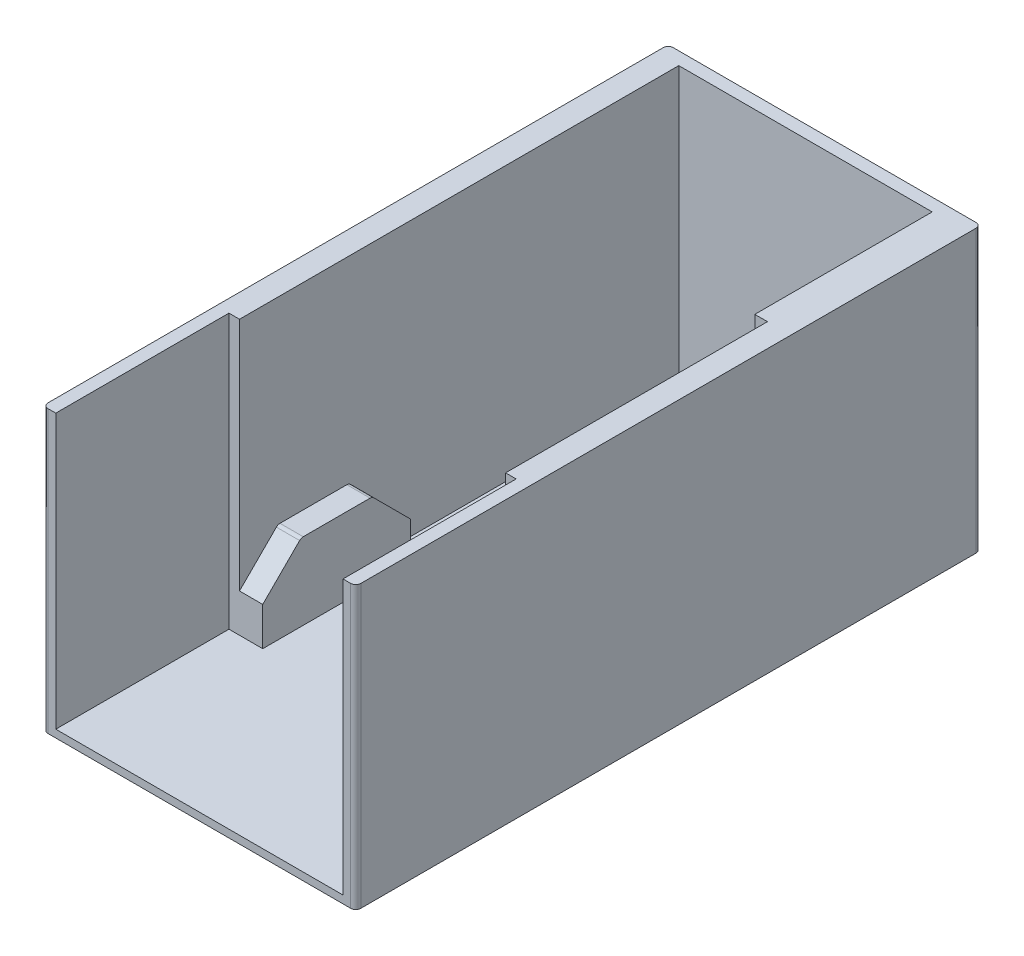
ISO-10303-21;
HEADER;
FILE_DESCRIPTION(('STEP AP214'),'2;1');
FILE_NAME('part.step','',(''),(''),'','','');
FILE_SCHEMA(('AUTOMOTIVE_DESIGN { 1 0 10303 214 1 1 1 1 }'));
ENDSEC;
DATA;
#1=APPLICATION_CONTEXT('core data for automotive mechanical design processes');
#2=APPLICATION_PROTOCOL_DEFINITION('international standard','automotive_design',2000,#1);
#3=PRODUCT_CONTEXT('',#1,'mechanical');
#4=PRODUCT('Part','Part','',(#3));
#5=PRODUCT_RELATED_PRODUCT_CATEGORY('part','',(#4));
#6=PRODUCT_DEFINITION_FORMATION('','',#4);
#7=PRODUCT_DEFINITION_CONTEXT('part definition',#1,'design');
#8=PRODUCT_DEFINITION('design','',#6,#7);
#9=PRODUCT_DEFINITION_SHAPE('','',#8);
#10=(LENGTH_UNIT() NAMED_UNIT(*) SI_UNIT(.MILLI.,.METRE.));
#11=(NAMED_UNIT(*) PLANE_ANGLE_UNIT() SI_UNIT($,.RADIAN.));
#12=(NAMED_UNIT(*) SI_UNIT($,.STERADIAN.) SOLID_ANGLE_UNIT());
#13=UNCERTAINTY_MEASURE_WITH_UNIT(LENGTH_MEASURE(1.E-05),#10,'distance_accuracy_value','');
#14=(GEOMETRIC_REPRESENTATION_CONTEXT(3) GLOBAL_UNCERTAINTY_ASSIGNED_CONTEXT((#13)) GLOBAL_UNIT_ASSIGNED_CONTEXT((#10,
#11,#12)) REPRESENTATION_CONTEXT('',''));
#15=CARTESIAN_POINT('',(0.,0.,0.));
#16=DIRECTION('',(0.,0.,1.));
#17=DIRECTION('',(1.,0.,0.));
#18=AXIS2_PLACEMENT_3D('',#15,#16,#17);
#19=CARTESIAN_POINT('',(0.,0.,0.));
#20=DIRECTION('',(0.,1.,0.));
#21=DIRECTION('',(0.,0.,1.));
#22=AXIS2_PLACEMENT_3D('',#19,#20,#21);
#23=PLANE('',#22);
#24=DIRECTION('',(0.,0.,-1.));
#25=VECTOR('',#24,1.);
#26=CARTESIAN_POINT('',(-804.2275,0.,0.));
#27=LINE('',#26,#25);
#28=CARTESIAN_POINT('',(-804.2275,0.,-2922.905));
#29=VERTEX_POINT('',#28);
#30=CARTESIAN_POINT('',(-804.2275,0.,-2990.596));
#31=VERTEX_POINT('',#30);
#32=EDGE_CURVE('E402',#29,#31,#27,.T.);
#33=ORIENTED_EDGE('',*,*,#32,.F.);
#34=DIRECTION('',(1.,0.,0.));
#35=VECTOR('',#34,1.);
#36=CARTESIAN_POINT('',(0.,0.,-2922.905));
#37=LINE('',#36,#35);
#38=CARTESIAN_POINT('',(-691.9595,0.,-2922.905));
#39=VERTEX_POINT('',#38);
#40=EDGE_CURVE('E272',#29,#39,#37,.T.);
#41=ORIENTED_EDGE('',*,*,#40,.T.);
#42=DIRECTION('',(0.,0.,-1.));
#43=VECTOR('',#42,1.);
#44=CARTESIAN_POINT('',(-691.9595,0.,0.));
#45=LINE('',#44,#43);
#46=CARTESIAN_POINT('',(-691.9595,0.,-2990.596));
#47=VERTEX_POINT('',#46);
#48=EDGE_CURVE('E399',#39,#47,#45,.T.);
#49=ORIENTED_EDGE('',*,*,#48,.T.);
#50=DIRECTION('',(1.,0.,0.));
#51=VECTOR('',#50,1.);
#52=CARTESIAN_POINT('',(0.,0.,-2990.596));
#53=LINE('',#52,#51);
#54=CARTESIAN_POINT('',(-705.1675,0.,-2990.596));
#55=VERTEX_POINT('',#54);
#56=EDGE_CURVE('E396',#55,#47,#53,.T.);
#57=ORIENTED_EDGE('',*,*,#56,.F.);
#58=DIRECTION('',(0.,0.,-1.));
#59=VECTOR('',#58,1.);
#60=CARTESIAN_POINT('',(-705.1675,0.,0.));
#61=LINE('',#60,#59);
#62=CARTESIAN_POINT('',(-705.1675,0.,-3048.381));
#63=VERTEX_POINT('',#62);
#64=EDGE_CURVE('E303',#55,#63,#61,.T.);
#65=ORIENTED_EDGE('',*,*,#64,.T.);
#66=DIRECTION('',(1.,0.,0.));
#67=VECTOR('',#66,1.);
#68=CARTESIAN_POINT('',(0.,0.,-3048.381));
#69=LINE('',#68,#67);
#70=CARTESIAN_POINT('',(-696.087,0.,-3048.381));
#71=VERTEX_POINT('',#70);
#72=EDGE_CURVE('E334',#63,#71,#69,.T.);
#73=ORIENTED_EDGE('',*,*,#72,.T.);
#74=DIRECTION('',(0.,0.,1.));
#75=VECTOR('',#74,1.);
#76=CARTESIAN_POINT('',(-696.087,0.,0.));
#77=LINE('',#76,#75);
#78=CARTESIAN_POINT('',(-696.087,0.,-3092.958));
#79=VERTEX_POINT('',#78);
#80=EDGE_CURVE('E393',#79,#71,#77,.T.);
#81=ORIENTED_EDGE('',*,*,#80,.F.);
#82=DIRECTION('',(1.,0.,0.));
#83=VECTOR('',#82,1.);
#84=CARTESIAN_POINT('',(0.,0.,-3092.958));
#85=LINE('',#84,#83);
#86=CARTESIAN_POINT('',(-701.04,0.,-3092.958));
#87=VERTEX_POINT('',#86);
#88=EDGE_CURVE('E391',#87,#79,#85,.T.);
#89=ORIENTED_EDGE('',*,*,#88,.F.);
#90=DIRECTION('',(0.,0.,-1.));
#91=VECTOR('',#90,1.);
#92=CARTESIAN_POINT('',(-701.04,0.,0.));
#93=LINE('',#92,#91);
#94=CARTESIAN_POINT('',(-701.04,0.,-3162.3));
#95=VERTEX_POINT('',#94);
#96=EDGE_CURVE('E388',#87,#95,#93,.T.);
#97=ORIENTED_EDGE('',*,*,#96,.T.);
#98=DIRECTION('',(1.,0.,0.));
#99=VECTOR('',#98,1.);
#100=CARTESIAN_POINT('',(0.,0.,-3162.3));
#101=LINE('',#100,#99);
#102=CARTESIAN_POINT('',(-800.1,0.,-3162.3));
#103=VERTEX_POINT('',#102);
#104=EDGE_CURVE('E350',#103,#95,#101,.T.);
#105=ORIENTED_EDGE('',*,*,#104,.F.);
#106=DIRECTION('',(0.,0.,1.));
#107=VECTOR('',#106,1.);
#108=CARTESIAN_POINT('',(-800.1,0.,0.));
#109=LINE('',#108,#107);
#110=CARTESIAN_POINT('',(-800.1,0.,-3048.381));
#111=VERTEX_POINT('',#110);
#112=EDGE_CURVE('E354',#103,#111,#109,.T.);
#113=ORIENTED_EDGE('',*,*,#112,.T.);
#114=DIRECTION('',(1.,0.,0.));
#115=VECTOR('',#114,1.);
#116=CARTESIAN_POINT('',(0.,0.,-3048.381));
#117=LINE('',#116,#115);
#118=CARTESIAN_POINT('',(-791.0195,0.,-3048.381));
#119=VERTEX_POINT('',#118);
#120=EDGE_CURVE('E314',#111,#119,#117,.T.);
#121=ORIENTED_EDGE('',*,*,#120,.T.);
#122=DIRECTION('',(0.,0.,-1.));
#123=VECTOR('',#122,1.);
#124=CARTESIAN_POINT('',(-791.0195,0.,0.));
#125=LINE('',#124,#123);
#126=CARTESIAN_POINT('',(-791.0195,0.,-2990.596));
#127=VERTEX_POINT('',#126);
#128=EDGE_CURVE('E318',#127,#119,#125,.T.);
#129=ORIENTED_EDGE('',*,*,#128,.F.);
#130=DIRECTION('',(1.,0.,0.));
#131=VECTOR('',#130,1.);
#132=CARTESIAN_POINT('',(0.,0.,-2990.596));
#133=LINE('',#132,#131);
#134=EDGE_CURVE('E404',#31,#127,#133,.T.);
#135=ORIENTED_EDGE('',*,*,#134,.F.);
#136=EDGE_LOOP('',(#33,#41,#49,#57,#65,#73,#81,#89,#97,#105,#113,#121,#129,#135));
#137=FACE_BOUND('',#136,.T.);
#138=ADVANCED_FACE('F43',(#137),#23,.T.);
#139=CARTESIAN_POINT('',(0.,-3.,0.));
#140=DIRECTION('',(0.,1.,0.));
#141=DIRECTION('',(0.,0.,1.));
#142=AXIS2_PLACEMENT_3D('',#139,#140,#141);
#143=PLANE('',#142);
#144=DIRECTION('',(0.,0.,-1.));
#145=VECTOR('',#144,1.);
#146=CARTESIAN_POINT('',(-686.9595,-3.,-2917.905));
#147=LINE('',#146,#145);
#148=CARTESIAN_POINT('',(-686.9595,-3.,-2924.905));
#149=VERTEX_POINT('',#148);
#150=CARTESIAN_POINT('',(-686.9595,-3.,-3165.3));
#151=VERTEX_POINT('',#150);
#152=EDGE_CURVE('E329',#149,#151,#147,.T.);
#153=ORIENTED_EDGE('',*,*,#152,.F.);
#154=CARTESIAN_POINT('',(-688.9595,-3.,-2924.905));
#155=DIRECTION('',(0.,1.,0.));
#156=DIRECTION('',(0.,0.,1.));
#157=AXIS2_PLACEMENT_3D('',#154,#155,#156);
#158=CIRCLE('',#157,2.);
#159=CARTESIAN_POINT('',(-688.9595,-3.,-2922.905));
#160=VERTEX_POINT('',#159);
#161=EDGE_CURVE('E267',#149,#160,#158,.F.);
#162=ORIENTED_EDGE('',*,*,#161,.T.);
#163=DIRECTION('',(1.,0.,0.));
#164=VECTOR('',#163,1.);
#165=CARTESIAN_POINT('',(0.,-3.,-2922.905));
#166=LINE('',#165,#164);
#167=CARTESIAN_POINT('',(-807.2275,-3.,-2922.905));
#168=VERTEX_POINT('',#167);
#169=EDGE_CURVE('E256',#168,#160,#166,.T.);
#170=ORIENTED_EDGE('',*,*,#169,.F.);
#171=CARTESIAN_POINT('',(-807.2275,-3.,-2924.905));
#172=DIRECTION('',(0.,1.,0.));
#173=DIRECTION('',(0.,0.,1.));
#174=AXIS2_PLACEMENT_3D('',#171,#172,#173);
#175=CIRCLE('',#174,2.);
#176=CARTESIAN_POINT('',(-809.2275,-3.,-2924.905));
#177=VERTEX_POINT('',#176);
#178=EDGE_CURVE('E265',#168,#177,#175,.F.);
#179=ORIENTED_EDGE('',*,*,#178,.T.);
#180=DIRECTION('',(0.,0.,-1.));
#181=VECTOR('',#180,1.);
#182=CARTESIAN_POINT('',(-809.2275,-3.,-2917.905));
#183=LINE('',#182,#181);
#184=CARTESIAN_POINT('',(-809.2275,-3.,-3165.3));
#185=VERTEX_POINT('',#184);
#186=EDGE_CURVE('E58',#177,#185,#183,.T.);
#187=ORIENTED_EDGE('',*,*,#186,.T.);
#188=CARTESIAN_POINT('',(-807.2275,-3.,-3165.3));
#189=DIRECTION('',(0.,1.,0.));
#190=DIRECTION('',(0.,0.,1.));
#191=AXIS2_PLACEMENT_3D('',#188,#189,#190);
#192=CIRCLE('',#191,2.);
#193=CARTESIAN_POINT('',(-807.2275,-3.,-3167.3));
#194=VERTEX_POINT('',#193);
#195=EDGE_CURVE('E62',#185,#194,#192,.F.);
#196=ORIENTED_EDGE('',*,*,#195,.T.);
#197=DIRECTION('',(-1.,0.,0.));
#198=VECTOR('',#197,1.);
#199=CARTESIAN_POINT('',(-686.9595,-3.,-3167.3));
#200=LINE('',#199,#198);
#201=CARTESIAN_POINT('',(-688.9595,-3.,-3167.3));
#202=VERTEX_POINT('',#201);
#203=EDGE_CURVE('E347',#202,#194,#200,.T.);
#204=ORIENTED_EDGE('',*,*,#203,.F.);
#205=CARTESIAN_POINT('',(-688.9595,-3.,-3165.3));
#206=DIRECTION('',(0.,1.,0.));
#207=DIRECTION('',(0.,0.,1.));
#208=AXIS2_PLACEMENT_3D('',#205,#206,#207);
#209=CIRCLE('',#208,2.);
#210=EDGE_CURVE('E482',#202,#151,#209,.F.);
#211=ORIENTED_EDGE('',*,*,#210,.T.);
#212=EDGE_LOOP('',(#153,#162,#170,#179,#187,#196,#204,#211));
#213=FACE_BOUND('',#212,.T.);
#214=ADVANCED_FACE('F270',(#213),#143,.F.);
#215=CARTESIAN_POINT('',(-705.1675,30.,0.));
#216=DIRECTION('',(-1.,0.,0.));
#217=DIRECTION('',(0.,0.,1.));
#218=AXIS2_PLACEMENT_3D('',#215,#216,#217);
#219=PLANE('',#218);
#220=DIRECTION('',(0.,0.,-1.));
#221=VECTOR('',#220,1.);
#222=CARTESIAN_POINT('',(-705.1675,30.,0.));
#223=LINE('',#222,#221);
#224=CARTESIAN_POINT('',(-705.1675,30.,-3006.42442712475));
#225=VERTEX_POINT('',#224);
#226=CARTESIAN_POINT('',(-705.1675,30.,-3032.55257287525));
#227=VERTEX_POINT('',#226);
#228=EDGE_CURVE('E330',#225,#227,#223,.T.);
#229=ORIENTED_EDGE('',*,*,#228,.T.);
#230=CARTESIAN_POINT('',(-705.1675,28.,-3032.55257287525));
#231=DIRECTION('',(-1.,0.,0.));
#232=DIRECTION('',(0.,0.,1.));
#233=AXIS2_PLACEMENT_3D('',#230,#231,#232);
#234=CIRCLE('',#233,2.);
#235=CARTESIAN_POINT('',(-705.1675,29.4142135623732,-3033.96678643763));
#236=VERTEX_POINT('',#235);
#237=EDGE_CURVE('E441',#227,#236,#234,.T.);
#238=ORIENTED_EDGE('',*,*,#237,.T.);
#239=DIRECTION('',(0.,0.707106781186545,0.70710678118655));
#240=VECTOR('',#239,1.);
#241=CARTESIAN_POINT('',(-705.1675,1531.6905,-1531.69049999999));
#242=LINE('',#241,#240);
#243=CARTESIAN_POINT('',(-705.1675,14.9999999999996,-3048.381));
#244=VERTEX_POINT('',#243);
#245=EDGE_CURVE('E278',#244,#236,#242,.T.);
#246=ORIENTED_EDGE('',*,*,#245,.F.);
#247=DIRECTION('',(0.,-1.,0.));
#248=VECTOR('',#247,1.);
#249=CARTESIAN_POINT('',(-705.1675,30.,-3048.381));
#250=LINE('',#249,#248);
#251=EDGE_CURVE('E337',#244,#63,#250,.T.);
#252=ORIENTED_EDGE('',*,*,#251,.T.);
#253=ORIENTED_EDGE('',*,*,#64,.F.);
#254=DIRECTION('',(0.,-1.,0.));
#255=VECTOR('',#254,1.);
#256=CARTESIAN_POINT('',(-705.1675,30.,-2990.596));
#257=LINE('',#256,#255);
#258=CARTESIAN_POINT('',(-705.1675,15.0000000000003,-2990.596));
#259=VERTEX_POINT('',#258);
#260=EDGE_CURVE('E321',#259,#55,#257,.T.);
#261=ORIENTED_EDGE('',*,*,#260,.F.);
#262=DIRECTION('',(0.,0.707106781186556,-0.707106781186539));
#263=VECTOR('',#262,1.);
#264=CARTESIAN_POINT('',(-705.1675,-1487.798,-1487.79800000004));
#265=LINE('',#264,#263);
#266=CARTESIAN_POINT('',(-705.1675,29.4142135623734,-3005.01021356237));
#267=VERTEX_POINT('',#266);
#268=EDGE_CURVE('E282',#259,#267,#265,.T.);
#269=ORIENTED_EDGE('',*,*,#268,.T.);
#270=CARTESIAN_POINT('',(-705.1675,28.,-3006.42442712475));
#271=DIRECTION('',(-1.,0.,0.));
#272=DIRECTION('',(0.,0.,1.));
#273=AXIS2_PLACEMENT_3D('',#270,#271,#272);
#274=CIRCLE('',#273,2.);
#275=EDGE_CURVE('E439',#267,#225,#274,.T.);
#276=ORIENTED_EDGE('',*,*,#275,.T.);
#277=EDGE_LOOP('',(#229,#238,#246,#252,#253,#261,#269,#276));
#278=FACE_BOUND('',#277,.T.);
#279=ADVANCED_FACE('F565',(#278),#219,.T.);
#280=CARTESIAN_POINT('',(0.,30.,0.));
#281=DIRECTION('',(0.,1.,0.));
#282=DIRECTION('',(0.,0.,1.));
#283=AXIS2_PLACEMENT_3D('',#280,#281,#282);
#284=PLANE('',#283);
#285=DIRECTION('',(0.,0.,-1.));
#286=VECTOR('',#285,1.);
#287=CARTESIAN_POINT('',(-696.087,30.,0.));
#288=LINE('',#287,#286);
#289=CARTESIAN_POINT('',(-696.087,30.,-3006.42442712475));
#290=VERTEX_POINT('',#289);
#291=CARTESIAN_POINT('',(-696.087,30.,-3032.55257287525));
#292=VERTEX_POINT('',#291);
#293=EDGE_CURVE('E333',#290,#292,#288,.T.);
#294=ORIENTED_EDGE('',*,*,#293,.T.);
#295=DIRECTION('',(-1.,0.,0.));
#296=VECTOR('',#295,1.);
#297=CARTESIAN_POINT('',(-705.1675,30.,-3032.55257287525));
#298=LINE('',#297,#296);
#299=EDGE_CURVE('E436',#292,#227,#298,.T.);
#300=ORIENTED_EDGE('',*,*,#299,.T.);
#301=ORIENTED_EDGE('',*,*,#228,.F.);
#302=DIRECTION('',(-1.,0.,0.));
#303=VECTOR('',#302,1.);
#304=CARTESIAN_POINT('',(0.,30.,-3006.42442712475));
#305=LINE('',#304,#303);
#306=EDGE_CURVE('E434',#225,#290,#305,.F.);
#307=ORIENTED_EDGE('',*,*,#306,.T.);
#308=EDGE_LOOP('',(#294,#300,#301,#307));
#309=FACE_BOUND('',#308,.T.);
#310=ADVANCED_FACE('F642',(#309),#284,.T.);
#311=CARTESIAN_POINT('',(-791.0195,30.,0.));
#312=DIRECTION('',(-1.,0.,0.));
#313=DIRECTION('',(0.,0.,1.));
#314=AXIS2_PLACEMENT_3D('',#311,#312,#313);
#315=PLANE('',#314);
#316=DIRECTION('',(0.,0.707106781186545,0.70710678118655));
#317=VECTOR('',#316,1.);
#318=CARTESIAN_POINT('',(-791.0195,1531.6905,-1531.69049999999));
#319=LINE('',#318,#317);
#320=CARTESIAN_POINT('',(-791.0195,14.9999999999996,-3048.381));
#321=VERTEX_POINT('',#320);
#322=CARTESIAN_POINT('',(-791.0195,29.4142135623732,-3033.96678643763));
#323=VERTEX_POINT('',#322);
#324=EDGE_CURVE('E287',#321,#323,#319,.T.);
#325=ORIENTED_EDGE('',*,*,#324,.T.);
#326=CARTESIAN_POINT('',(-791.0195,28.,-3032.55257287525));
#327=DIRECTION('',(-1.,0.,0.));
#328=DIRECTION('',(0.,0.,1.));
#329=AXIS2_PLACEMENT_3D('',#326,#327,#328);
#330=CIRCLE('',#329,2.);
#331=CARTESIAN_POINT('',(-791.0195,30.,-3032.55257287525));
#332=VERTEX_POINT('',#331);
#333=EDGE_CURVE('E453',#323,#332,#330,.F.);
#334=ORIENTED_EDGE('',*,*,#333,.T.);
#335=DIRECTION('',(0.,0.,-1.));
#336=VECTOR('',#335,1.);
#337=CARTESIAN_POINT('',(-791.0195,30.,0.));
#338=LINE('',#337,#336);
#339=CARTESIAN_POINT('',(-791.0195,30.,-3006.42442712475));
#340=VERTEX_POINT('',#339);
#341=EDGE_CURVE('E310',#340,#332,#338,.T.);
#342=ORIENTED_EDGE('',*,*,#341,.F.);
#343=CARTESIAN_POINT('',(-791.0195,28.,-3006.42442712475));
#344=DIRECTION('',(-1.,0.,0.));
#345=DIRECTION('',(0.,0.,1.));
#346=AXIS2_PLACEMENT_3D('',#343,#344,#345);
#347=CIRCLE('',#346,2.);
#348=CARTESIAN_POINT('',(-791.0195,29.4142135623734,-3005.01021356237));
#349=VERTEX_POINT('',#348);
#350=EDGE_CURVE('E451',#340,#349,#347,.F.);
#351=ORIENTED_EDGE('',*,*,#350,.T.);
#352=DIRECTION('',(0.,0.707106781186556,-0.707106781186539));
#353=VECTOR('',#352,1.);
#354=CARTESIAN_POINT('',(-791.0195,-1487.798,-1487.79800000004));
#355=LINE('',#354,#353);
#356=CARTESIAN_POINT('',(-791.0195,15.0000000000003,-2990.596));
#357=VERTEX_POINT('',#356);
#358=EDGE_CURVE('E295',#357,#349,#355,.T.);
#359=ORIENTED_EDGE('',*,*,#358,.F.);
#360=DIRECTION('',(0.,-1.,0.));
#361=VECTOR('',#360,1.);
#362=CARTESIAN_POINT('',(-791.0195,30.,-2990.596));
#363=LINE('',#362,#361);
#364=EDGE_CURVE('E327',#357,#127,#363,.T.);
#365=ORIENTED_EDGE('',*,*,#364,.T.);
#366=ORIENTED_EDGE('',*,*,#128,.T.);
#367=DIRECTION('',(0.,-1.,0.));
#368=VECTOR('',#367,1.);
#369=CARTESIAN_POINT('',(-791.0195,30.,-3048.381));
#370=LINE('',#369,#368);
#371=EDGE_CURVE('E325',#321,#119,#370,.T.);
#372=ORIENTED_EDGE('',*,*,#371,.F.);
#373=EDGE_LOOP('',(#325,#334,#342,#351,#359,#365,#366,#372));
#374=FACE_BOUND('',#373,.T.);
#375=ADVANCED_FACE('F505',(#374),#315,.F.);
#376=CARTESIAN_POINT('',(0.,30.,-3048.381));
#377=DIRECTION('',(0.,0.,-1.));
#378=DIRECTION('',(-1.,0.,0.));
#379=AXIS2_PLACEMENT_3D('',#376,#377,#378);
#380=PLANE('',#379);
#381=DIRECTION('',(0.,-1.,0.));
#382=VECTOR('',#381,1.);
#383=CARTESIAN_POINT('',(-800.1,30.,-3048.381));
#384=LINE('',#383,#382);
#385=CARTESIAN_POINT('',(-800.1,14.9999999999996,-3048.381));
#386=VERTEX_POINT('',#385);
#387=EDGE_CURVE('E317',#386,#111,#384,.T.);
#388=ORIENTED_EDGE('',*,*,#387,.F.);
#389=DIRECTION('',(1.,0.,0.));
#390=VECTOR('',#389,1.);
#391=CARTESIAN_POINT('',(-821.313203435597,14.9999999999996,-3048.381));
#392=LINE('',#391,#390);
#393=EDGE_CURVE('E305',#386,#321,#392,.T.);
#394=ORIENTED_EDGE('',*,*,#393,.T.);
#395=ORIENTED_EDGE('',*,*,#371,.T.);
#396=ORIENTED_EDGE('',*,*,#120,.F.);
#397=EDGE_LOOP('',(#388,#394,#395,#396));
#398=FACE_BOUND('',#397,.T.);
#399=ADVANCED_FACE('F532',(#398),#380,.T.);
#400=CARTESIAN_POINT('',(0.,30.,0.));
#401=DIRECTION('',(0.,1.,0.));
#402=DIRECTION('',(0.,0.,1.));
#403=AXIS2_PLACEMENT_3D('',#400,#401,#402);
#404=PLANE('',#403);
#405=ORIENTED_EDGE('',*,*,#341,.T.);
#406=DIRECTION('',(1.,0.,0.));
#407=VECTOR('',#406,1.);
#408=CARTESIAN_POINT('',(0.,30.,-3032.55257287525));
#409=LINE('',#408,#407);
#410=CARTESIAN_POINT('',(-800.1,30.,-3032.55257287525));
#411=VERTEX_POINT('',#410);
#412=EDGE_CURVE('E458',#332,#411,#409,.F.);
#413=ORIENTED_EDGE('',*,*,#412,.T.);
#414=DIRECTION('',(0.,0.,1.));
#415=VECTOR('',#414,1.);
#416=CARTESIAN_POINT('',(-800.1,30.,0.));
#417=LINE('',#416,#415);
#418=CARTESIAN_POINT('',(-800.1,30.,-3006.42442712475));
#419=VERTEX_POINT('',#418);
#420=EDGE_CURVE('E313',#411,#419,#417,.T.);
#421=ORIENTED_EDGE('',*,*,#420,.T.);
#422=DIRECTION('',(1.,0.,0.));
#423=VECTOR('',#422,1.);
#424=CARTESIAN_POINT('',(-791.0195,30.,-3006.42442712475));
#425=LINE('',#424,#423);
#426=EDGE_CURVE('E455',#419,#340,#425,.T.);
#427=ORIENTED_EDGE('',*,*,#426,.T.);
#428=EDGE_LOOP('',(#405,#413,#421,#427));
#429=FACE_BOUND('',#428,.T.);
#430=ADVANCED_FACE('F508',(#429),#404,.T.);
#431=CARTESIAN_POINT('',(0.,107.,-3162.3));
#432=DIRECTION('',(0.,0.,-1.));
#433=DIRECTION('',(-1.,0.,0.));
#434=AXIS2_PLACEMENT_3D('',#431,#432,#433);
#435=PLANE('',#434);
#436=ORIENTED_EDGE('',*,*,#104,.T.);
#437=DIRECTION('',(0.,-1.,0.));
#438=VECTOR('',#437,1.);
#439=CARTESIAN_POINT('',(-701.04,107.,-3162.3));
#440=LINE('',#439,#438);
#441=CARTESIAN_POINT('',(-701.04,107.,-3162.3));
#442=VERTEX_POINT('',#441);
#443=EDGE_CURVE('E431',#442,#95,#440,.T.);
#444=ORIENTED_EDGE('',*,*,#443,.F.);
#445=DIRECTION('',(1.,0.,0.));
#446=VECTOR('',#445,1.);
#447=CARTESIAN_POINT('',(0.,107.,-3162.3));
#448=LINE('',#447,#446);
#449=CARTESIAN_POINT('',(-800.1,107.,-3162.3));
#450=VERTEX_POINT('',#449);
#451=EDGE_CURVE('E351',#450,#442,#448,.T.);
#452=ORIENTED_EDGE('',*,*,#451,.F.);
#453=DIRECTION('',(0.,-1.,0.));
#454=VECTOR('',#453,1.);
#455=CARTESIAN_POINT('',(-800.1,107.,-3162.3));
#456=LINE('',#455,#454);
#457=EDGE_CURVE('E386',#450,#103,#456,.T.);
#458=ORIENTED_EDGE('',*,*,#457,.T.);
#459=EDGE_LOOP('',(#436,#444,#452,#458));
#460=FACE_BOUND('',#459,.T.);
#461=ADVANCED_FACE('F538',(#460),#435,.F.);
#462=CARTESIAN_POINT('',(-701.04,107.,0.));
#463=DIRECTION('',(-1.,0.,0.));
#464=DIRECTION('',(0.,0.,1.));
#465=AXIS2_PLACEMENT_3D('',#462,#463,#464);
#466=PLANE('',#465);
#467=ORIENTED_EDGE('',*,*,#96,.F.);
#468=DIRECTION('',(0.,-1.,0.));
#469=VECTOR('',#468,1.);
#470=CARTESIAN_POINT('',(-701.04,107.,-3092.958));
#471=LINE('',#470,#469);
#472=CARTESIAN_POINT('',(-701.04,107.,-3092.958));
#473=VERTEX_POINT('',#472);
#474=EDGE_CURVE('E429',#473,#87,#471,.T.);
#475=ORIENTED_EDGE('',*,*,#474,.F.);
#476=DIRECTION('',(0.,0.,-1.));
#477=VECTOR('',#476,1.);
#478=CARTESIAN_POINT('',(-701.04,107.,0.));
#479=LINE('',#478,#477);
#480=EDGE_CURVE('E353',#473,#442,#479,.T.);
#481=ORIENTED_EDGE('',*,*,#480,.T.);
#482=ORIENTED_EDGE('',*,*,#443,.T.);
#483=EDGE_LOOP('',(#467,#475,#481,#482));
#484=FACE_BOUND('',#483,.T.);
#485=ADVANCED_FACE('F540',(#484),#466,.T.);
#486=CARTESIAN_POINT('',(0.,107.,-3092.958));
#487=DIRECTION('',(0.,0.,-1.));
#488=DIRECTION('',(-1.,0.,0.));
#489=AXIS2_PLACEMENT_3D('',#486,#487,#488);
#490=PLANE('',#489);
#491=ORIENTED_EDGE('',*,*,#88,.T.);
#492=DIRECTION('',(0.,-1.,0.));
#493=VECTOR('',#492,1.);
#494=CARTESIAN_POINT('',(-696.087,107.,-3092.958));
#495=LINE('',#494,#493);
#496=CARTESIAN_POINT('',(-696.087,107.,-3092.958));
#497=VERTEX_POINT('',#496);
#498=EDGE_CURVE('E426',#497,#79,#495,.T.);
#499=ORIENTED_EDGE('',*,*,#498,.F.);
#500=DIRECTION('',(1.,0.,0.));
#501=VECTOR('',#500,1.);
#502=CARTESIAN_POINT('',(0.,107.,-3092.958));
#503=LINE('',#502,#501);
#504=EDGE_CURVE('E357',#473,#497,#503,.T.);
#505=ORIENTED_EDGE('',*,*,#504,.F.);
#506=ORIENTED_EDGE('',*,*,#474,.T.);
#507=EDGE_LOOP('',(#491,#499,#505,#506));
#508=FACE_BOUND('',#507,.T.);
#509=ADVANCED_FACE('F578',(#508),#490,.F.);
#510=CARTESIAN_POINT('',(-696.087,107.,0.));
#511=DIRECTION('',(1.,0.,0.));
#512=DIRECTION('',(0.,0.,-1.));
#513=AXIS2_PLACEMENT_3D('',#510,#511,#512);
#514=PLANE('',#513);
#515=DIRECTION('',(0.,-1.,0.));
#516=VECTOR('',#515,1.);
#517=CARTESIAN_POINT('',(-696.087,30.,-3048.381));
#518=LINE('',#517,#516);
#519=CARTESIAN_POINT('',(-696.087,14.9999999999997,-3048.381));
#520=VERTEX_POINT('',#519);
#521=EDGE_CURVE('E343',#520,#71,#518,.T.);
#522=ORIENTED_EDGE('',*,*,#521,.F.);
#523=DIRECTION('',(0.,0.707106781186545,0.70710678118655));
#524=VECTOR('',#523,1.);
#525=CARTESIAN_POINT('',(-696.087,1531.6905,-1531.69049999999));
#526=LINE('',#525,#524);
#527=CARTESIAN_POINT('',(-696.087,29.4142135623732,-3033.96678643763));
#528=VERTEX_POINT('',#527);
#529=EDGE_CURVE('E281',#520,#528,#526,.T.);
#530=ORIENTED_EDGE('',*,*,#529,.T.);
#531=CARTESIAN_POINT('',(-696.087,28.,-3032.55257287525));
#532=DIRECTION('',(1.,0.,0.));
#533=DIRECTION('',(0.,0.,-1.));
#534=AXIS2_PLACEMENT_3D('',#531,#532,#533);
#535=CIRCLE('',#534,2.);
#536=EDGE_CURVE('E262',#528,#292,#535,.T.);
#537=ORIENTED_EDGE('',*,*,#536,.T.);
#538=ORIENTED_EDGE('',*,*,#293,.F.);
#539=CARTESIAN_POINT('',(-696.087,28.,-3006.42442712475));
#540=DIRECTION('',(1.,0.,0.));
#541=DIRECTION('',(0.,0.,-1.));
#542=AXIS2_PLACEMENT_3D('',#539,#540,#541);
#543=CIRCLE('',#542,2.);
#544=CARTESIAN_POINT('',(-696.087,29.4142135623734,-3005.01021356237));
#545=VERTEX_POINT('',#544);
#546=EDGE_CURVE('E489',#290,#545,#543,.T.);
#547=ORIENTED_EDGE('',*,*,#546,.T.);
#548=DIRECTION('',(0.,0.707106781186556,-0.707106781186539));
#549=VECTOR('',#548,1.);
#550=CARTESIAN_POINT('',(-696.087,-1487.798,-1487.79800000004));
#551=LINE('',#550,#549);
#552=CARTESIAN_POINT('',(-696.087,15.0000000000003,-2990.596));
#553=VERTEX_POINT('',#552);
#554=EDGE_CURVE('E276',#553,#545,#551,.T.);
#555=ORIENTED_EDGE('',*,*,#554,.F.);
#556=DIRECTION('',(0.,-1.,0.));
#557=VECTOR('',#556,1.);
#558=CARTESIAN_POINT('',(-696.087,107.,-2990.596));
#559=LINE('',#558,#557);
#560=CARTESIAN_POINT('',(-696.087,107.,-2990.596));
#561=VERTEX_POINT('',#560);
#562=EDGE_CURVE('E424',#561,#553,#559,.T.);
#563=ORIENTED_EDGE('',*,*,#562,.F.);
#564=DIRECTION('',(0.,0.,1.));
#565=VECTOR('',#564,1.);
#566=CARTESIAN_POINT('',(-696.087,107.,0.));
#567=LINE('',#566,#565);
#568=EDGE_CURVE('E359',#497,#561,#567,.T.);
#569=ORIENTED_EDGE('',*,*,#568,.F.);
#570=ORIENTED_EDGE('',*,*,#498,.T.);
#571=ORIENTED_EDGE('',*,*,#80,.T.);
#572=EDGE_LOOP('',(#522,#530,#537,#538,#547,#555,#563,#569,#570,#571));
#573=FACE_BOUND('',#572,.T.);
#574=ADVANCED_FACE('F574',(#573),#514,.F.);
#575=CARTESIAN_POINT('',(0.,107.,-2990.596));
#576=DIRECTION('',(0.,0.,-1.));
#577=DIRECTION('',(-1.,0.,0.));
#578=AXIS2_PLACEMENT_3D('',#575,#576,#577);
#579=PLANE('',#578);
#580=ORIENTED_EDGE('',*,*,#562,.T.);
#581=DIRECTION('',(-1.,0.,0.));
#582=VECTOR('',#581,1.);
#583=CARTESIAN_POINT('',(-674.873796564403,15.0000000000003,-2990.596));
#584=LINE('',#583,#582);
#585=EDGE_CURVE('E290',#553,#259,#584,.T.);
#586=ORIENTED_EDGE('',*,*,#585,.T.);
#587=ORIENTED_EDGE('',*,*,#260,.T.);
#588=ORIENTED_EDGE('',*,*,#56,.T.);
#589=DIRECTION('',(0.,-1.,0.));
#590=VECTOR('',#589,1.);
#591=CARTESIAN_POINT('',(-691.9595,107.,-2990.596));
#592=LINE('',#591,#590);
#593=CARTESIAN_POINT('',(-691.9595,107.,-2990.596));
#594=VERTEX_POINT('',#593);
#595=EDGE_CURVE('E422',#594,#47,#592,.T.);
#596=ORIENTED_EDGE('',*,*,#595,.F.);
#597=DIRECTION('',(1.,0.,0.));
#598=VECTOR('',#597,1.);
#599=CARTESIAN_POINT('',(0.,107.,-2990.596));
#600=LINE('',#599,#598);
#601=EDGE_CURVE('E361',#561,#594,#600,.T.);
#602=ORIENTED_EDGE('',*,*,#601,.F.);
#603=EDGE_LOOP('',(#580,#586,#587,#588,#596,#602));
#604=FACE_BOUND('',#603,.T.);
#605=ADVANCED_FACE('F560',(#604),#579,.F.);
#606=CARTESIAN_POINT('',(-691.9595,107.,0.));
#607=DIRECTION('',(-1.,0.,0.));
#608=DIRECTION('',(0.,0.,1.));
#609=AXIS2_PLACEMENT_3D('',#606,#607,#608);
#610=PLANE('',#609);
#611=ORIENTED_EDGE('',*,*,#48,.F.);
#612=DIRECTION('',(0.,-1.,0.));
#613=VECTOR('',#612,1.);
#614=CARTESIAN_POINT('',(-691.9595,107.,-2922.905));
#615=LINE('',#614,#613);
#616=CARTESIAN_POINT('',(-691.9595,107.,-2922.905));
#617=VERTEX_POINT('',#616);
#618=EDGE_CURVE('E419',#617,#39,#615,.T.);
#619=ORIENTED_EDGE('',*,*,#618,.F.);
#620=DIRECTION('',(0.,0.,-1.));
#621=VECTOR('',#620,1.);
#622=CARTESIAN_POINT('',(-691.9595,107.,0.));
#623=LINE('',#622,#621);
#624=EDGE_CURVE('E363',#617,#594,#623,.T.);
#625=ORIENTED_EDGE('',*,*,#624,.T.);
#626=ORIENTED_EDGE('',*,*,#595,.T.);
#627=EDGE_LOOP('',(#611,#619,#625,#626));
#628=FACE_BOUND('',#627,.T.);
#629=ADVANCED_FACE('F556',(#628),#610,.T.);
#630=CARTESIAN_POINT('',(-686.9595,107.,0.));
#631=DIRECTION('',(-1.,0.,0.));
#632=DIRECTION('',(0.,0.,1.));
#633=AXIS2_PLACEMENT_3D('',#630,#631,#632);
#634=PLANE('',#633);
#635=DIRECTION('',(0.,-1.,0.));
#636=VECTOR('',#635,1.);
#637=CARTESIAN_POINT('',(-686.9595,107.,-2924.905));
#638=LINE('',#637,#636);
#639=CARTESIAN_POINT('',(-686.9595,107.,-2924.905));
#640=VERTEX_POINT('',#639);
#641=EDGE_CURVE('E464',#640,#149,#638,.T.);
#642=ORIENTED_EDGE('',*,*,#641,.T.);
#643=ORIENTED_EDGE('',*,*,#152,.T.);
#644=DIRECTION('',(0.,-1.,0.));
#645=VECTOR('',#644,1.);
#646=CARTESIAN_POINT('',(-686.9595,107.,-3165.3));
#647=LINE('',#646,#645);
#648=CARTESIAN_POINT('',(-686.9595,107.,-3165.3));
#649=VERTEX_POINT('',#648);
#650=EDGE_CURVE('E462',#151,#649,#647,.F.);
#651=ORIENTED_EDGE('',*,*,#650,.T.);
#652=DIRECTION('',(0.,0.,-1.));
#653=VECTOR('',#652,1.);
#654=CARTESIAN_POINT('',(-686.9595,107.,0.));
#655=LINE('',#654,#653);
#656=EDGE_CURVE('E369',#640,#649,#655,.T.);
#657=ORIENTED_EDGE('',*,*,#656,.F.);
#658=EDGE_LOOP('',(#642,#643,#651,#657));
#659=FACE_BOUND('',#658,.T.);
#660=ADVANCED_FACE('F614',(#659),#634,.F.);
#661=CARTESIAN_POINT('',(0.,107.,-3167.3));
#662=DIRECTION('',(0.,0.,1.));
#663=DIRECTION('',(1.,0.,0.));
#664=AXIS2_PLACEMENT_3D('',#661,#662,#663);
#665=PLANE('',#664);
#666=DIRECTION('',(-1.,0.,0.));
#667=VECTOR('',#666,1.);
#668=CARTESIAN_POINT('',(0.,107.,-3167.3));
#669=LINE('',#668,#667);
#670=CARTESIAN_POINT('',(-688.9595,107.,-3167.3));
#671=VERTEX_POINT('',#670);
#672=CARTESIAN_POINT('',(-807.2275,107.,-3167.3));
#673=VERTEX_POINT('',#672);
#674=EDGE_CURVE('E372',#671,#673,#669,.T.);
#675=ORIENTED_EDGE('',*,*,#674,.F.);
#676=DIRECTION('',(0.,-1.,0.));
#677=VECTOR('',#676,1.);
#678=CARTESIAN_POINT('',(-688.9595,107.,-3167.3));
#679=LINE('',#678,#677);
#680=EDGE_CURVE('E478',#671,#202,#679,.T.);
#681=ORIENTED_EDGE('',*,*,#680,.T.);
#682=ORIENTED_EDGE('',*,*,#203,.T.);
#683=DIRECTION('',(0.,-1.,0.));
#684=VECTOR('',#683,1.);
#685=CARTESIAN_POINT('',(-807.2275,107.,-3167.3));
#686=LINE('',#685,#684);
#687=EDGE_CURVE('E476',#194,#673,#686,.F.);
#688=ORIENTED_EDGE('',*,*,#687,.T.);
#689=EDGE_LOOP('',(#675,#681,#682,#688));
#690=FACE_BOUND('',#689,.T.);
#691=ADVANCED_FACE('F610',(#690),#665,.F.);
#692=CARTESIAN_POINT('',(-809.2275,107.,0.));
#693=DIRECTION('',(-1.,0.,0.));
#694=DIRECTION('',(0.,0.,1.));
#695=AXIS2_PLACEMENT_3D('',#692,#693,#694);
#696=PLANE('',#695);
#697=ORIENTED_EDGE('',*,*,#186,.F.);
#698=DIRECTION('',(0.,-1.,0.));
#699=VECTOR('',#698,1.);
#700=CARTESIAN_POINT('',(-809.2275,107.,-2924.905));
#701=LINE('',#700,#699);
#702=CARTESIAN_POINT('',(-809.2275,107.,-2924.905));
#703=VERTEX_POINT('',#702);
#704=EDGE_CURVE('E266',#177,#703,#701,.F.);
#705=ORIENTED_EDGE('',*,*,#704,.T.);
#706=DIRECTION('',(0.,0.,-1.));
#707=VECTOR('',#706,1.);
#708=CARTESIAN_POINT('',(-809.2275,107.,0.));
#709=LINE('',#708,#707);
#710=CARTESIAN_POINT('',(-809.2275,107.,-3165.3));
#711=VERTEX_POINT('',#710);
#712=EDGE_CURVE('E375',#703,#711,#709,.T.);
#713=ORIENTED_EDGE('',*,*,#712,.T.);
#714=DIRECTION('',(0.,-1.,0.));
#715=VECTOR('',#714,1.);
#716=CARTESIAN_POINT('',(-809.2275,-3.,-3165.3));
#717=LINE('',#716,#715);
#718=EDGE_CURVE('E263',#711,#185,#717,.T.);
#719=ORIENTED_EDGE('',*,*,#718,.T.);
#720=EDGE_LOOP('',(#697,#705,#713,#719));
#721=FACE_BOUND('',#720,.T.);
#722=ADVANCED_FACE('F607',(#721),#696,.T.);
#723=CARTESIAN_POINT('',(0.,107.,-2922.905));
#724=DIRECTION('',(0.,0.,1.));
#725=DIRECTION('',(1.,0.,0.));
#726=AXIS2_PLACEMENT_3D('',#723,#724,#725);
#727=PLANE('',#726);
#728=DIRECTION('',(-1.,0.,0.));
#729=VECTOR('',#728,1.);
#730=CARTESIAN_POINT('',(0.,107.,-2922.905));
#731=LINE('',#730,#729);
#732=CARTESIAN_POINT('',(-804.2275,107.,-2922.905));
#733=VERTEX_POINT('',#732);
#734=CARTESIAN_POINT('',(-807.2275,107.,-2922.905));
#735=VERTEX_POINT('',#734);
#736=EDGE_CURVE('E259',#733,#735,#731,.T.);
#737=ORIENTED_EDGE('',*,*,#736,.T.);
#738=DIRECTION('',(0.,-1.,0.));
#739=VECTOR('',#738,1.);
#740=CARTESIAN_POINT('',(-807.2275,107.,-2922.905));
#741=LINE('',#740,#739);
#742=EDGE_CURVE('E252',#735,#168,#741,.T.);
#743=ORIENTED_EDGE('',*,*,#742,.T.);
#744=ORIENTED_EDGE('',*,*,#169,.T.);
#745=DIRECTION('',(0.,-1.,0.));
#746=VECTOR('',#745,1.);
#747=CARTESIAN_POINT('',(-688.9595,107.,-2922.905));
#748=LINE('',#747,#746);
#749=CARTESIAN_POINT('',(-688.9595,107.,-2922.905));
#750=VERTEX_POINT('',#749);
#751=EDGE_CURVE('E466',#160,#750,#748,.F.);
#752=ORIENTED_EDGE('',*,*,#751,.T.);
#753=DIRECTION('',(1.,0.,0.));
#754=VECTOR('',#753,1.);
#755=CARTESIAN_POINT('',(0.,107.,-2922.905));
#756=LINE('',#755,#754);
#757=EDGE_CURVE('E366',#617,#750,#756,.T.);
#758=ORIENTED_EDGE('',*,*,#757,.F.);
#759=ORIENTED_EDGE('',*,*,#618,.T.);
#760=ORIENTED_EDGE('',*,*,#40,.F.);
#761=DIRECTION('',(0.,-1.,0.));
#762=VECTOR('',#761,1.);
#763=CARTESIAN_POINT('',(-804.2275,107.,-2922.905));
#764=LINE('',#763,#762);
#765=EDGE_CURVE('E416',#733,#29,#764,.T.);
#766=ORIENTED_EDGE('',*,*,#765,.F.);
#767=EDGE_LOOP('',(#737,#743,#744,#752,#758,#759,#760,#766));
#768=FACE_BOUND('',#767,.T.);
#769=ADVANCED_FACE('F254',(#768),#727,.T.);
#770=CARTESIAN_POINT('',(-804.2275,107.,0.));
#771=DIRECTION('',(-1.,0.,0.));
#772=DIRECTION('',(0.,0.,1.));
#773=AXIS2_PLACEMENT_3D('',#770,#771,#772);
#774=PLANE('',#773);
#775=ORIENTED_EDGE('',*,*,#32,.T.);
#776=DIRECTION('',(0.,-1.,0.));
#777=VECTOR('',#776,1.);
#778=CARTESIAN_POINT('',(-804.2275,107.,-2990.596));
#779=LINE('',#778,#777);
#780=CARTESIAN_POINT('',(-804.2275,107.,-2990.596));
#781=VERTEX_POINT('',#780);
#782=EDGE_CURVE('E413',#781,#31,#779,.T.);
#783=ORIENTED_EDGE('',*,*,#782,.F.);
#784=DIRECTION('',(0.,0.,-1.));
#785=VECTOR('',#784,1.);
#786=CARTESIAN_POINT('',(-804.2275,107.,0.));
#787=LINE('',#786,#785);
#788=EDGE_CURVE('E379',#733,#781,#787,.T.);
#789=ORIENTED_EDGE('',*,*,#788,.F.);
#790=ORIENTED_EDGE('',*,*,#765,.T.);
#791=EDGE_LOOP('',(#775,#783,#789,#790));
#792=FACE_BOUND('',#791,.T.);
#793=ADVANCED_FACE('F550',(#792),#774,.F.);
#794=CARTESIAN_POINT('',(0.,107.,-2990.596));
#795=DIRECTION('',(0.,0.,-1.));
#796=DIRECTION('',(-1.,0.,0.));
#797=AXIS2_PLACEMENT_3D('',#794,#795,#796);
#798=PLANE('',#797);
#799=ORIENTED_EDGE('',*,*,#364,.F.);
#800=DIRECTION('',(1.,0.,0.));
#801=VECTOR('',#800,1.);
#802=CARTESIAN_POINT('',(-821.313203435597,15.0000000000003,-2990.596));
#803=LINE('',#802,#801);
#804=CARTESIAN_POINT('',(-800.1,15.0000000000001,-2990.596));
#805=VERTEX_POINT('',#804);
#806=EDGE_CURVE('E298',#805,#357,#803,.T.);
#807=ORIENTED_EDGE('',*,*,#806,.F.);
#808=DIRECTION('',(0.,-1.,0.));
#809=VECTOR('',#808,1.);
#810=CARTESIAN_POINT('',(-800.1,107.,-2990.596));
#811=LINE('',#810,#809);
#812=CARTESIAN_POINT('',(-800.1,107.,-2990.596));
#813=VERTEX_POINT('',#812);
#814=EDGE_CURVE('E410',#813,#805,#811,.T.);
#815=ORIENTED_EDGE('',*,*,#814,.F.);
#816=DIRECTION('',(1.,0.,0.));
#817=VECTOR('',#816,1.);
#818=CARTESIAN_POINT('',(0.,107.,-2990.596));
#819=LINE('',#818,#817);
#820=EDGE_CURVE('E381',#781,#813,#819,.T.);
#821=ORIENTED_EDGE('',*,*,#820,.F.);
#822=ORIENTED_EDGE('',*,*,#782,.T.);
#823=ORIENTED_EDGE('',*,*,#134,.T.);
#824=EDGE_LOOP('',(#799,#807,#815,#821,#822,#823));
#825=FACE_BOUND('',#824,.T.);
#826=ADVANCED_FACE('F522',(#825),#798,.F.);
#827=CARTESIAN_POINT('',(-800.1,107.,0.));
#828=DIRECTION('',(1.,0.,0.));
#829=DIRECTION('',(0.,0.,-1.));
#830=AXIS2_PLACEMENT_3D('',#827,#828,#829);
#831=PLANE('',#830);
#832=ORIENTED_EDGE('',*,*,#420,.F.);
#833=CARTESIAN_POINT('',(-800.1,28.,-3032.55257287525));
#834=DIRECTION('',(1.,0.,0.));
#835=DIRECTION('',(0.,0.,-1.));
#836=AXIS2_PLACEMENT_3D('',#833,#834,#835);
#837=CIRCLE('',#836,2.);
#838=CARTESIAN_POINT('',(-800.1,29.4142135623732,-3033.96678643763));
#839=VERTEX_POINT('',#838);
#840=EDGE_CURVE('E51',#411,#839,#837,.F.);
#841=ORIENTED_EDGE('',*,*,#840,.T.);
#842=DIRECTION('',(0.,-0.707106781186545,-0.70710678118655));
#843=VECTOR('',#842,1.);
#844=CARTESIAN_POINT('',(-800.1,1531.6905,-1531.69049999999));
#845=LINE('',#844,#843);
#846=EDGE_CURVE('E299',#839,#386,#845,.T.);
#847=ORIENTED_EDGE('',*,*,#846,.T.);
#848=ORIENTED_EDGE('',*,*,#387,.T.);
#849=ORIENTED_EDGE('',*,*,#112,.F.);
#850=ORIENTED_EDGE('',*,*,#457,.F.);
#851=DIRECTION('',(0.,0.,1.));
#852=VECTOR('',#851,1.);
#853=CARTESIAN_POINT('',(-800.1,107.,0.));
#854=LINE('',#853,#852);
#855=EDGE_CURVE('E383',#450,#813,#854,.T.);
#856=ORIENTED_EDGE('',*,*,#855,.T.);
#857=ORIENTED_EDGE('',*,*,#814,.T.);
#858=DIRECTION('',(0.,-0.707106781186556,0.707106781186539));
#859=VECTOR('',#858,1.);
#860=CARTESIAN_POINT('',(-800.1,-1487.798,-1487.79800000004));
#861=LINE('',#860,#859);
#862=CARTESIAN_POINT('',(-800.1,29.4142135623734,-3005.01021356237));
#863=VERTEX_POINT('',#862);
#864=EDGE_CURVE('E301',#863,#805,#861,.T.);
#865=ORIENTED_EDGE('',*,*,#864,.F.);
#866=CARTESIAN_POINT('',(-800.1,28.,-3006.42442712475));
#867=DIRECTION('',(1.,0.,0.));
#868=DIRECTION('',(0.,0.,-1.));
#869=AXIS2_PLACEMENT_3D('',#866,#867,#868);
#870=CIRCLE('',#869,2.);
#871=EDGE_CURVE('E11',#863,#419,#870,.F.);
#872=ORIENTED_EDGE('',*,*,#871,.T.);
#873=EDGE_LOOP('',(#832,#841,#847,#848,#849,#850,#856,#857,#865,#872));
#874=FACE_BOUND('',#873,.T.);
#875=ADVANCED_FACE('F494',(#874),#831,.T.);
#876=CARTESIAN_POINT('',(0.,107.,0.));
#877=DIRECTION('',(0.,1.,0.));
#878=DIRECTION('',(0.,0.,1.));
#879=AXIS2_PLACEMENT_3D('',#876,#877,#878);
#880=PLANE('',#879);
#881=ORIENTED_EDGE('',*,*,#757,.T.);
#882=CARTESIAN_POINT('',(-688.9595,107.,-2924.905));
#883=DIRECTION('',(0.,1.,0.));
#884=DIRECTION('',(0.,0.,1.));
#885=AXIS2_PLACEMENT_3D('',#882,#883,#884);
#886=CIRCLE('',#885,2.);
#887=EDGE_CURVE('E474',#750,#640,#886,.T.);
#888=ORIENTED_EDGE('',*,*,#887,.T.);
#889=ORIENTED_EDGE('',*,*,#656,.T.);
#890=CARTESIAN_POINT('',(-688.9595,107.,-3165.3));
#891=DIRECTION('',(0.,1.,0.));
#892=DIRECTION('',(0.,0.,1.));
#893=AXIS2_PLACEMENT_3D('',#890,#891,#892);
#894=CIRCLE('',#893,2.);
#895=EDGE_CURVE('E472',#649,#671,#894,.T.);
#896=ORIENTED_EDGE('',*,*,#895,.T.);
#897=ORIENTED_EDGE('',*,*,#674,.T.);
#898=CARTESIAN_POINT('',(-807.2275,107.,-3165.3));
#899=DIRECTION('',(0.,1.,0.));
#900=DIRECTION('',(0.,0.,1.));
#901=AXIS2_PLACEMENT_3D('',#898,#899,#900);
#902=CIRCLE('',#901,2.);
#903=EDGE_CURVE('E470',#673,#711,#902,.T.);
#904=ORIENTED_EDGE('',*,*,#903,.T.);
#905=ORIENTED_EDGE('',*,*,#712,.F.);
#906=CARTESIAN_POINT('',(-807.2275,107.,-2924.905));
#907=DIRECTION('',(0.,1.,0.));
#908=DIRECTION('',(0.,0.,1.));
#909=AXIS2_PLACEMENT_3D('',#906,#907,#908);
#910=CIRCLE('',#909,2.);
#911=EDGE_CURVE('E468',#703,#735,#910,.T.);
#912=ORIENTED_EDGE('',*,*,#911,.T.);
#913=ORIENTED_EDGE('',*,*,#736,.F.);
#914=ORIENTED_EDGE('',*,*,#788,.T.);
#915=ORIENTED_EDGE('',*,*,#820,.T.);
#916=ORIENTED_EDGE('',*,*,#855,.F.);
#917=ORIENTED_EDGE('',*,*,#451,.T.);
#918=ORIENTED_EDGE('',*,*,#480,.F.);
#919=ORIENTED_EDGE('',*,*,#504,.T.);
#920=ORIENTED_EDGE('',*,*,#568,.T.);
#921=ORIENTED_EDGE('',*,*,#601,.T.);
#922=ORIENTED_EDGE('',*,*,#624,.F.);
#923=EDGE_LOOP('',(#881,#888,#889,#896,#897,#904,#905,#912,#913,#914,#915,#916,#917,#918,#919,
#920,#921,#922));
#924=FACE_BOUND('',#923,.T.);
#925=ADVANCED_FACE('F544',(#924),#880,.T.);
#926=CARTESIAN_POINT('',(0.,30.,-3048.381));
#927=DIRECTION('',(0.,0.,-1.));
#928=DIRECTION('',(-1.,0.,0.));
#929=AXIS2_PLACEMENT_3D('',#926,#927,#928);
#930=PLANE('',#929);
#931=DIRECTION('',(-1.,0.,0.));
#932=VECTOR('',#931,1.);
#933=CARTESIAN_POINT('',(-674.873796564403,14.9999999999996,-3048.381));
#934=LINE('',#933,#932);
#935=EDGE_CURVE('E285',#520,#244,#934,.T.);
#936=ORIENTED_EDGE('',*,*,#935,.F.);
#937=ORIENTED_EDGE('',*,*,#521,.T.);
#938=ORIENTED_EDGE('',*,*,#72,.F.);
#939=ORIENTED_EDGE('',*,*,#251,.F.);
#940=EDGE_LOOP('',(#936,#937,#938,#939));
#941=FACE_BOUND('',#940,.T.);
#942=ADVANCED_FACE('F570',(#941),#930,.T.);
#943=CARTESIAN_POINT('',(-821.313203435597,1531.6905,-1531.69049999999));
#944=DIRECTION('',(0.,0.70710678118655,-0.707106781186545));
#945=DIRECTION('',(0.,0.707106781186545,0.70710678118655));
#946=AXIS2_PLACEMENT_3D('',#943,#944,#945);
#947=PLANE('',#946);
#948=ORIENTED_EDGE('',*,*,#846,.F.);
#949=DIRECTION('',(1.,0.,0.));
#950=VECTOR('',#949,1.);
#951=CARTESIAN_POINT('',(-821.313203435597,29.4142135623734,-3033.96678643763));
#952=LINE('',#951,#950);
#953=EDGE_CURVE('E448',#839,#323,#952,.T.);
#954=ORIENTED_EDGE('',*,*,#953,.T.);
#955=ORIENTED_EDGE('',*,*,#324,.F.);
#956=ORIENTED_EDGE('',*,*,#393,.F.);
#957=EDGE_LOOP('',(#948,#954,#955,#956));
#958=FACE_BOUND('',#957,.T.);
#959=ADVANCED_FACE('F500',(#958),#947,.T.);
#960=CARTESIAN_POINT('',(-821.313203435597,-1487.798,-1487.79800000004));
#961=DIRECTION('',(0.,-0.707106781186539,-0.707106781186556));
#962=DIRECTION('',(0.,0.707106781186556,-0.707106781186539));
#963=AXIS2_PLACEMENT_3D('',#960,#961,#962);
#964=PLANE('',#963);
#965=ORIENTED_EDGE('',*,*,#358,.T.);
#966=DIRECTION('',(1.,0.,0.));
#967=VECTOR('',#966,1.);
#968=CARTESIAN_POINT('',(-800.1,29.4142135623732,-3005.01021356237));
#969=LINE('',#968,#967);
#970=EDGE_CURVE('E460',#349,#863,#969,.F.);
#971=ORIENTED_EDGE('',*,*,#970,.T.);
#972=ORIENTED_EDGE('',*,*,#864,.T.);
#973=ORIENTED_EDGE('',*,*,#806,.T.);
#974=EDGE_LOOP('',(#965,#971,#972,#973));
#975=FACE_BOUND('',#974,.T.);
#976=ADVANCED_FACE('F517',(#975),#964,.F.);
#977=CARTESIAN_POINT('',(-674.873796564403,-1487.798,-1487.79800000004));
#978=DIRECTION('',(0.,0.707106781186539,0.707106781186556));
#979=DIRECTION('',(0.,-0.707106781186556,0.707106781186539));
#980=AXIS2_PLACEMENT_3D('',#977,#978,#979);
#981=PLANE('',#980);
#982=ORIENTED_EDGE('',*,*,#554,.T.);
#983=DIRECTION('',(-1.,0.,0.));
#984=VECTOR('',#983,1.);
#985=CARTESIAN_POINT('',(-674.873796564403,29.4142135623732,-3005.01021356237));
#986=LINE('',#985,#984);
#987=EDGE_CURVE('E445',#545,#267,#986,.T.);
#988=ORIENTED_EDGE('',*,*,#987,.T.);
#989=ORIENTED_EDGE('',*,*,#268,.F.);
#990=ORIENTED_EDGE('',*,*,#585,.F.);
#991=EDGE_LOOP('',(#982,#988,#989,#990));
#992=FACE_BOUND('',#991,.T.);
#993=ADVANCED_FACE('F698',(#992),#981,.T.);
#994=CARTESIAN_POINT('',(-674.873796564403,1531.6905,-1531.69049999999));
#995=DIRECTION('',(0.,-0.70710678118655,0.707106781186545));
#996=DIRECTION('',(0.,-0.707106781186545,-0.70710678118655));
#997=AXIS2_PLACEMENT_3D('',#994,#995,#996);
#998=PLANE('',#997);
#999=ORIENTED_EDGE('',*,*,#245,.T.);
#1000=DIRECTION('',(-1.,0.,0.));
#1001=VECTOR('',#1000,1.);
#1002=CARTESIAN_POINT('',(-696.087,29.4142135623734,-3033.96678643763));
#1003=LINE('',#1002,#1001);
#1004=EDGE_CURVE('E443',#236,#528,#1003,.F.);
#1005=ORIENTED_EDGE('',*,*,#1004,.T.);
#1006=ORIENTED_EDGE('',*,*,#529,.F.);
#1007=ORIENTED_EDGE('',*,*,#935,.T.);
#1008=EDGE_LOOP('',(#999,#1005,#1006,#1007));
#1009=FACE_BOUND('',#1008,.T.);
#1010=ADVANCED_FACE('F704',(#1009),#998,.F.);
#1011=CARTESIAN_POINT('',(0.,28.,-3032.55257287525));
#1012=DIRECTION('',(1.,0.,0.));
#1013=DIRECTION('',(0.,0.,-1.));
#1014=AXIS2_PLACEMENT_3D('',#1011,#1012,#1013);
#1015=CYLINDRICAL_SURFACE('',#1014,2.);
#1016=ORIENTED_EDGE('',*,*,#536,.F.);
#1017=ORIENTED_EDGE('',*,*,#1004,.F.);
#1018=ORIENTED_EDGE('',*,*,#237,.F.);
#1019=ORIENTED_EDGE('',*,*,#299,.F.);
#1020=EDGE_LOOP('',(#1016,#1017,#1018,#1019));
#1021=FACE_BOUND('',#1020,.T.);
#1022=ADVANCED_FACE('F712',(#1021),#1015,.T.);
#1023=CARTESIAN_POINT('',(-674.873796564403,28.,-3006.42442712475));
#1024=DIRECTION('',(-1.,0.,0.));
#1025=DIRECTION('',(0.,0.,1.));
#1026=AXIS2_PLACEMENT_3D('',#1023,#1024,#1025);
#1027=CYLINDRICAL_SURFACE('',#1026,2.);
#1028=ORIENTED_EDGE('',*,*,#546,.F.);
#1029=ORIENTED_EDGE('',*,*,#306,.F.);
#1030=ORIENTED_EDGE('',*,*,#275,.F.);
#1031=ORIENTED_EDGE('',*,*,#987,.F.);
#1032=EDGE_LOOP('',(#1028,#1029,#1030,#1031));
#1033=FACE_BOUND('',#1032,.T.);
#1034=ADVANCED_FACE('F721',(#1033),#1027,.T.);
#1035=CARTESIAN_POINT('',(-821.313203435597,28.,-3032.55257287525));
#1036=DIRECTION('',(1.,0.,0.));
#1037=DIRECTION('',(0.,0.,-1.));
#1038=AXIS2_PLACEMENT_3D('',#1035,#1036,#1037);
#1039=CYLINDRICAL_SURFACE('',#1038,2.);
#1040=ORIENTED_EDGE('',*,*,#840,.F.);
#1041=ORIENTED_EDGE('',*,*,#412,.F.);
#1042=ORIENTED_EDGE('',*,*,#333,.F.);
#1043=ORIENTED_EDGE('',*,*,#953,.F.);
#1044=EDGE_LOOP('',(#1040,#1041,#1042,#1043));
#1045=FACE_BOUND('',#1044,.T.);
#1046=ADVANCED_FACE('F502',(#1045),#1039,.T.);
#1047=CARTESIAN_POINT('',(0.,28.,-3006.42442712475));
#1048=DIRECTION('',(-1.,0.,0.));
#1049=DIRECTION('',(0.,0.,1.));
#1050=AXIS2_PLACEMENT_3D('',#1047,#1048,#1049);
#1051=CYLINDRICAL_SURFACE('',#1050,2.);
#1052=ORIENTED_EDGE('',*,*,#871,.F.);
#1053=ORIENTED_EDGE('',*,*,#970,.F.);
#1054=ORIENTED_EDGE('',*,*,#350,.F.);
#1055=ORIENTED_EDGE('',*,*,#426,.F.);
#1056=EDGE_LOOP('',(#1052,#1053,#1054,#1055));
#1057=FACE_BOUND('',#1056,.T.);
#1058=ADVANCED_FACE('F512',(#1057),#1051,.T.);
#1059=CARTESIAN_POINT('',(-688.9595,107.,-2924.905));
#1060=DIRECTION('',(0.,-1.,0.));
#1061=DIRECTION('',(0.,0.,-1.));
#1062=AXIS2_PLACEMENT_3D('',#1059,#1060,#1061);
#1063=CYLINDRICAL_SURFACE('',#1062,2.);
#1064=ORIENTED_EDGE('',*,*,#887,.F.);
#1065=ORIENTED_EDGE('',*,*,#751,.F.);
#1066=ORIENTED_EDGE('',*,*,#161,.F.);
#1067=ORIENTED_EDGE('',*,*,#641,.F.);
#1068=EDGE_LOOP('',(#1064,#1065,#1066,#1067));
#1069=FACE_BOUND('',#1068,.T.);
#1070=ADVANCED_FACE('F745',(#1069),#1063,.T.);
#1071=CARTESIAN_POINT('',(-688.9595,107.,-3165.3));
#1072=DIRECTION('',(0.,-1.,0.));
#1073=DIRECTION('',(0.,0.,-1.));
#1074=AXIS2_PLACEMENT_3D('',#1071,#1072,#1073);
#1075=CYLINDRICAL_SURFACE('',#1074,2.);
#1076=ORIENTED_EDGE('',*,*,#895,.F.);
#1077=ORIENTED_EDGE('',*,*,#650,.F.);
#1078=ORIENTED_EDGE('',*,*,#210,.F.);
#1079=ORIENTED_EDGE('',*,*,#680,.F.);
#1080=EDGE_LOOP('',(#1076,#1077,#1078,#1079));
#1081=FACE_BOUND('',#1080,.T.);
#1082=ADVANCED_FACE('F751',(#1081),#1075,.T.);
#1083=CARTESIAN_POINT('',(-807.2275,107.,-3165.3));
#1084=DIRECTION('',(0.,1.,0.));
#1085=DIRECTION('',(0.,0.,1.));
#1086=AXIS2_PLACEMENT_3D('',#1083,#1084,#1085);
#1087=CYLINDRICAL_SURFACE('',#1086,2.);
#1088=ORIENTED_EDGE('',*,*,#903,.F.);
#1089=ORIENTED_EDGE('',*,*,#687,.F.);
#1090=ORIENTED_EDGE('',*,*,#195,.F.);
#1091=ORIENTED_EDGE('',*,*,#718,.F.);
#1092=EDGE_LOOP('',(#1088,#1089,#1090,#1091));
#1093=FACE_BOUND('',#1092,.T.);
#1094=ADVANCED_FACE('F754',(#1093),#1087,.T.);
#1095=CARTESIAN_POINT('',(-807.2275,107.,-2924.905));
#1096=DIRECTION('',(0.,-1.,0.));
#1097=DIRECTION('',(0.,0.,-1.));
#1098=AXIS2_PLACEMENT_3D('',#1095,#1096,#1097);
#1099=CYLINDRICAL_SURFACE('',#1098,2.);
#1100=ORIENTED_EDGE('',*,*,#911,.F.);
#1101=ORIENTED_EDGE('',*,*,#704,.F.);
#1102=ORIENTED_EDGE('',*,*,#178,.F.);
#1103=ORIENTED_EDGE('',*,*,#742,.F.);
#1104=EDGE_LOOP('',(#1100,#1101,#1102,#1103));
#1105=FACE_BOUND('',#1104,.T.);
#1106=ADVANCED_FACE('F45',(#1105),#1099,.T.);
#1107=CLOSED_SHELL('',(#138,#214,#279,#310,#375,#399,#430,#461,#485,#509,#574,#605,#629,#660,
#691,#722,#769,#793,#826,#875,#925,#942,#959,#976,#993,#1010,#1022,#1034,#1046,#1058,#1070,
#1082,#1094,#1106));
#1108=MANIFOLD_SOLID_BREP('B2',#1107);
#1109=ADVANCED_BREP_SHAPE_REPRESENTATION('',(#18,#1108),#14);
#1110=SHAPE_DEFINITION_REPRESENTATION(#9,#1109);
ENDSEC;
END-ISO-10303-21;
